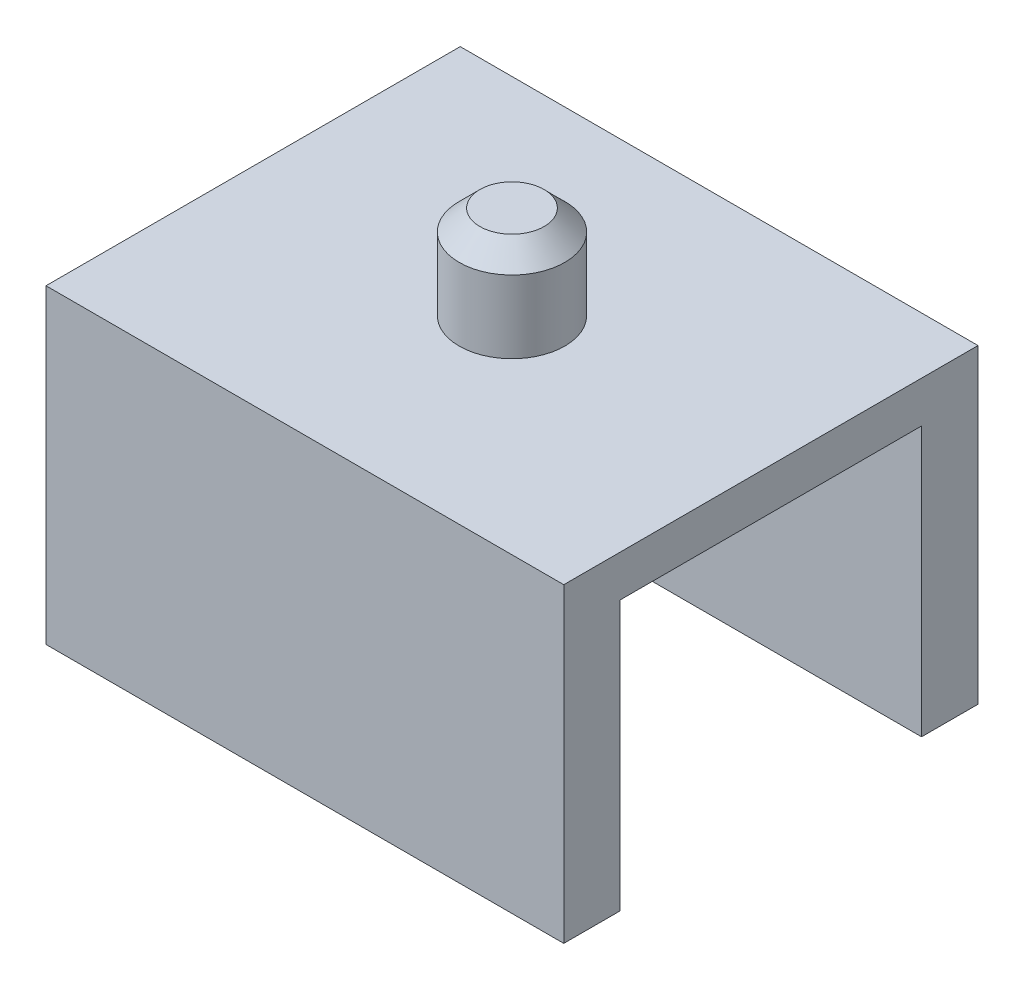
ISO-10303-21;
HEADER;
FILE_DESCRIPTION(('STEP AP214'),'2;1');
FILE_NAME('part.step','',(''),(''),'','','');
FILE_SCHEMA(('AUTOMOTIVE_DESIGN { 1 0 10303 214 1 1 1 1 }'));
ENDSEC;
DATA;
#1=APPLICATION_CONTEXT('core data for automotive mechanical design processes');
#2=APPLICATION_PROTOCOL_DEFINITION('international standard','automotive_design',2000,#1);
#3=PRODUCT_CONTEXT('',#1,'mechanical');
#4=PRODUCT('Part','Part','',(#3));
#5=PRODUCT_RELATED_PRODUCT_CATEGORY('part','',(#4));
#6=PRODUCT_DEFINITION_FORMATION('','',#4);
#7=PRODUCT_DEFINITION_CONTEXT('part definition',#1,'design');
#8=PRODUCT_DEFINITION('design','',#6,#7);
#9=PRODUCT_DEFINITION_SHAPE('','',#8);
#10=(LENGTH_UNIT() NAMED_UNIT(*) SI_UNIT(.MILLI.,.METRE.));
#11=(NAMED_UNIT(*) PLANE_ANGLE_UNIT() SI_UNIT($,.RADIAN.));
#12=(NAMED_UNIT(*) SI_UNIT($,.STERADIAN.) SOLID_ANGLE_UNIT());
#13=UNCERTAINTY_MEASURE_WITH_UNIT(LENGTH_MEASURE(1.E-05),#10,'distance_accuracy_value','');
#14=(GEOMETRIC_REPRESENTATION_CONTEXT(3) GLOBAL_UNCERTAINTY_ASSIGNED_CONTEXT((#13)) GLOBAL_UNIT_ASSIGNED_CONTEXT((#10,
#11,#12)) REPRESENTATION_CONTEXT('',''));
#15=CARTESIAN_POINT('',(0.,0.,0.));
#16=DIRECTION('',(0.,0.,1.));
#17=DIRECTION('',(1.,0.,0.));
#18=AXIS2_PLACEMENT_3D('',#15,#16,#17);
#19=CARTESIAN_POINT('',(25.,0.,20.));
#20=DIRECTION('',(0.,1.,0.));
#21=DIRECTION('',(-1.,0.,0.));
#22=AXIS2_PLACEMENT_3D('',#19,#20,#21);
#23=PLANE('',#22);
#24=DIRECTION('',(0.,0.,-1.));
#25=VECTOR('',#24,1.);
#26=CARTESIAN_POINT('',(0.,0.,20.));
#27=LINE('',#26,#25);
#28=CARTESIAN_POINT('',(0.,0.,20.));
#29=VERTEX_POINT('',#28);
#30=CARTESIAN_POINT('',(0.,0.,17.275));
#31=VERTEX_POINT('',#30);
#32=EDGE_CURVE('E170',#29,#31,#27,.T.);
#33=ORIENTED_EDGE('',*,*,#32,.T.);
#34=DIRECTION('',(-1.,0.,0.));
#35=VECTOR('',#34,1.);
#36=CARTESIAN_POINT('',(25.,0.,17.275));
#37=LINE('',#36,#35);
#38=CARTESIAN_POINT('',(25.,0.,17.275));
#39=VERTEX_POINT('',#38);
#40=EDGE_CURVE('E135',#39,#31,#37,.T.);
#41=ORIENTED_EDGE('',*,*,#40,.F.);
#42=DIRECTION('',(0.,0.,-1.));
#43=VECTOR('',#42,1.);
#44=CARTESIAN_POINT('',(25.,0.,20.));
#45=LINE('',#44,#43);
#46=CARTESIAN_POINT('',(25.,0.,20.));
#47=VERTEX_POINT('',#46);
#48=EDGE_CURVE('E183',#47,#39,#45,.T.);
#49=ORIENTED_EDGE('',*,*,#48,.F.);
#50=DIRECTION('',(1.,0.,0.));
#51=VECTOR('',#50,1.);
#52=CARTESIAN_POINT('',(25.,0.,20.));
#53=LINE('',#52,#51);
#54=EDGE_CURVE('E147',#29,#47,#53,.T.);
#55=ORIENTED_EDGE('',*,*,#54,.F.);
#56=EDGE_LOOP('',(#33,#41,#49,#55));
#57=FACE_BOUND('',#56,.T.);
#58=ADVANCED_FACE('F41',(#57),#23,.F.);
#59=CARTESIAN_POINT('',(25.,0.,2.725));
#60=VERTEX_POINT('',#59);
#61=CARTESIAN_POINT('',(25.,0.,0.));
#62=VERTEX_POINT('',#61);
#63=EDGE_CURVE('E182',#60,#62,#45,.T.);
#64=ORIENTED_EDGE('',*,*,#63,.F.);
#65=DIRECTION('',(1.,0.,0.));
#66=VECTOR('',#65,1.);
#67=CARTESIAN_POINT('',(0.,0.,2.725));
#68=LINE('',#67,#66);
#69=CARTESIAN_POINT('',(0.,0.,2.725));
#70=VERTEX_POINT('',#69);
#71=EDGE_CURVE('E251',#70,#60,#68,.T.);
#72=ORIENTED_EDGE('',*,*,#71,.F.);
#73=CARTESIAN_POINT('',(0.,0.,0.));
#74=VERTEX_POINT('',#73);
#75=EDGE_CURVE('E89',#70,#74,#27,.T.);
#76=ORIENTED_EDGE('',*,*,#75,.T.);
#77=DIRECTION('',(1.,0.,0.));
#78=VECTOR('',#77,1.);
#79=CARTESIAN_POINT('',(25.,0.,0.));
#80=LINE('',#79,#78);
#81=EDGE_CURVE('E158',#74,#62,#80,.T.);
#82=ORIENTED_EDGE('',*,*,#81,.T.);
#83=EDGE_LOOP('',(#64,#72,#76,#82));
#84=FACE_BOUND('',#83,.T.);
#85=ADVANCED_FACE('F209',(#84),#23,.F.);
#86=CARTESIAN_POINT('',(25.,15.,20.));
#87=DIRECTION('',(-1.,0.,0.));
#88=DIRECTION('',(0.,-1.,0.));
#89=AXIS2_PLACEMENT_3D('',#86,#87,#88);
#90=PLANE('',#89);
#91=ORIENTED_EDGE('',*,*,#48,.T.);
#92=DIRECTION('',(0.,-1.,0.));
#93=VECTOR('',#92,1.);
#94=CARTESIAN_POINT('',(25.,13.,17.275));
#95=LINE('',#94,#93);
#96=CARTESIAN_POINT('',(25.,13.,17.275));
#97=VERTEX_POINT('',#96);
#98=EDGE_CURVE('E142',#97,#39,#95,.T.);
#99=ORIENTED_EDGE('',*,*,#98,.F.);
#100=DIRECTION('',(0.,0.,1.));
#101=VECTOR('',#100,1.);
#102=CARTESIAN_POINT('',(25.,13.,2.725));
#103=LINE('',#102,#101);
#104=CARTESIAN_POINT('',(25.,13.,2.725));
#105=VERTEX_POINT('',#104);
#106=EDGE_CURVE('E127',#105,#97,#103,.T.);
#107=ORIENTED_EDGE('',*,*,#106,.F.);
#108=DIRECTION('',(0.,-1.,0.));
#109=VECTOR('',#108,1.);
#110=CARTESIAN_POINT('',(25.,13.,2.725));
#111=LINE('',#110,#109);
#112=EDGE_CURVE('E124',#105,#60,#111,.T.);
#113=ORIENTED_EDGE('',*,*,#112,.T.);
#114=ORIENTED_EDGE('',*,*,#63,.T.);
#115=DIRECTION('',(0.,1.,0.));
#116=VECTOR('',#115,1.);
#117=CARTESIAN_POINT('',(25.,15.,0.));
#118=LINE('',#117,#116);
#119=CARTESIAN_POINT('',(25.,15.,0.));
#120=VERTEX_POINT('',#119);
#121=EDGE_CURVE('E161',#62,#120,#118,.T.);
#122=ORIENTED_EDGE('',*,*,#121,.T.);
#123=DIRECTION('',(0.,0.,-1.));
#124=VECTOR('',#123,1.);
#125=CARTESIAN_POINT('',(25.,15.,20.));
#126=LINE('',#125,#124);
#127=CARTESIAN_POINT('',(25.,15.,20.));
#128=VERTEX_POINT('',#127);
#129=EDGE_CURVE('E178',#128,#120,#126,.T.);
#130=ORIENTED_EDGE('',*,*,#129,.F.);
#131=DIRECTION('',(0.,1.,0.));
#132=VECTOR('',#131,1.);
#133=CARTESIAN_POINT('',(25.,15.,20.));
#134=LINE('',#133,#132);
#135=EDGE_CURVE('E97',#47,#128,#134,.T.);
#136=ORIENTED_EDGE('',*,*,#135,.F.);
#137=EDGE_LOOP('',(#91,#99,#107,#113,#114,#122,#130,#136));
#138=FACE_BOUND('',#137,.T.);
#139=ADVANCED_FACE('F215',(#138),#90,.F.);
#140=CARTESIAN_POINT('',(0.,15.,20.));
#141=DIRECTION('',(0.,-1.,0.));
#142=DIRECTION('',(0.,0.,-1.));
#143=AXIS2_PLACEMENT_3D('',#140,#141,#142);
#144=PLANE('',#143);
#145=CARTESIAN_POINT('',(12.5,15.,10.));
#146=DIRECTION('',(0.,1.,0.));
#147=DIRECTION('',(0.,0.,1.));
#148=AXIS2_PLACEMENT_3D('',#145,#146,#147);
#149=CIRCLE('',#148,2.55);
#150=CARTESIAN_POINT('',(12.5,15.,12.55));
#151=VERTEX_POINT('',#150);
#152=EDGE_CURVE('E186',#151,#151,#149,.T.);
#153=ORIENTED_EDGE('',*,*,#152,.F.);
#154=EDGE_LOOP('',(#153));
#155=FACE_BOUND('',#154,.T.);
#156=DIRECTION('',(-1.,0.,0.));
#157=VECTOR('',#156,1.);
#158=CARTESIAN_POINT('',(0.,15.,0.));
#159=LINE('',#158,#157);
#160=CARTESIAN_POINT('',(0.,15.,0.));
#161=VERTEX_POINT('',#160);
#162=EDGE_CURVE('E165',#120,#161,#159,.T.);
#163=ORIENTED_EDGE('',*,*,#162,.T.);
#164=DIRECTION('',(0.,0.,-1.));
#165=VECTOR('',#164,1.);
#166=CARTESIAN_POINT('',(0.,15.,20.));
#167=LINE('',#166,#165);
#168=CARTESIAN_POINT('',(0.,15.,20.));
#169=VERTEX_POINT('',#168);
#170=EDGE_CURVE('E174',#169,#161,#167,.T.);
#171=ORIENTED_EDGE('',*,*,#170,.F.);
#172=DIRECTION('',(-1.,0.,0.));
#173=VECTOR('',#172,1.);
#174=CARTESIAN_POINT('',(0.,15.,20.));
#175=LINE('',#174,#173);
#176=EDGE_CURVE('E153',#128,#169,#175,.T.);
#177=ORIENTED_EDGE('',*,*,#176,.F.);
#178=ORIENTED_EDGE('',*,*,#129,.T.);
#179=EDGE_LOOP('',(#163,#171,#177,#178));
#180=FACE_BOUND('',#179,.T.);
#181=ADVANCED_FACE('F265',(#155,#180),#144,.F.);
#182=CARTESIAN_POINT('',(0.,0.,20.));
#183=DIRECTION('',(1.,0.,0.));
#184=DIRECTION('',(0.,0.,-1.));
#185=AXIS2_PLACEMENT_3D('',#182,#183,#184);
#186=PLANE('',#185);
#187=DIRECTION('',(0.,0.,-1.));
#188=VECTOR('',#187,1.);
#189=CARTESIAN_POINT('',(0.,13.,17.275));
#190=LINE('',#189,#188);
#191=CARTESIAN_POINT('',(0.,13.,17.275));
#192=VERTEX_POINT('',#191);
#193=CARTESIAN_POINT('',(0.,13.,2.725));
#194=VERTEX_POINT('',#193);
#195=EDGE_CURVE('E128',#192,#194,#190,.T.);
#196=ORIENTED_EDGE('',*,*,#195,.F.);
#197=DIRECTION('',(0.,-1.,0.));
#198=VECTOR('',#197,1.);
#199=CARTESIAN_POINT('',(0.,13.,17.275));
#200=LINE('',#199,#198);
#201=EDGE_CURVE('E162',#192,#31,#200,.T.);
#202=ORIENTED_EDGE('',*,*,#201,.T.);
#203=ORIENTED_EDGE('',*,*,#32,.F.);
#204=DIRECTION('',(0.,-1.,0.));
#205=VECTOR('',#204,1.);
#206=CARTESIAN_POINT('',(0.,0.,20.));
#207=LINE('',#206,#205);
#208=EDGE_CURVE('E67',#169,#29,#207,.T.);
#209=ORIENTED_EDGE('',*,*,#208,.F.);
#210=ORIENTED_EDGE('',*,*,#170,.T.);
#211=DIRECTION('',(0.,-1.,0.));
#212=VECTOR('',#211,1.);
#213=CARTESIAN_POINT('',(0.,0.,0.));
#214=LINE('',#213,#212);
#215=EDGE_CURVE('E150',#161,#74,#214,.T.);
#216=ORIENTED_EDGE('',*,*,#215,.T.);
#217=ORIENTED_EDGE('',*,*,#75,.F.);
#218=DIRECTION('',(0.,-1.,0.));
#219=VECTOR('',#218,1.);
#220=CARTESIAN_POINT('',(0.,13.,2.725));
#221=LINE('',#220,#219);
#222=EDGE_CURVE('E122',#194,#70,#221,.T.);
#223=ORIENTED_EDGE('',*,*,#222,.F.);
#224=EDGE_LOOP('',(#196,#202,#203,#209,#210,#216,#217,#223));
#225=FACE_BOUND('',#224,.T.);
#226=ADVANCED_FACE('F137',(#225),#186,.F.);
#227=CARTESIAN_POINT('',(0.,0.,20.));
#228=DIRECTION('',(0.,0.,-1.));
#229=DIRECTION('',(-1.,0.,0.));
#230=AXIS2_PLACEMENT_3D('',#227,#228,#229);
#231=PLANE('',#230);
#232=ORIENTED_EDGE('',*,*,#54,.T.);
#233=ORIENTED_EDGE('',*,*,#135,.T.);
#234=ORIENTED_EDGE('',*,*,#176,.T.);
#235=ORIENTED_EDGE('',*,*,#208,.T.);
#236=EDGE_LOOP('',(#232,#233,#234,#235));
#237=FACE_BOUND('',#236,.T.);
#238=ADVANCED_FACE('F272',(#237),#231,.F.);
#239=CARTESIAN_POINT('',(0.,0.,0.));
#240=DIRECTION('',(0.,0.,-1.));
#241=DIRECTION('',(-1.,0.,0.));
#242=AXIS2_PLACEMENT_3D('',#239,#240,#241);
#243=PLANE('',#242);
#244=ORIENTED_EDGE('',*,*,#81,.F.);
#245=ORIENTED_EDGE('',*,*,#215,.F.);
#246=ORIENTED_EDGE('',*,*,#162,.F.);
#247=ORIENTED_EDGE('',*,*,#121,.F.);
#248=EDGE_LOOP('',(#244,#245,#246,#247));
#249=FACE_BOUND('',#248,.T.);
#250=ADVANCED_FACE('F276',(#249),#243,.T.);
#251=CARTESIAN_POINT('',(25.,13.,17.275));
#252=DIRECTION('',(0.,0.,1.));
#253=DIRECTION('',(1.,0.,0.));
#254=AXIS2_PLACEMENT_3D('',#251,#252,#253);
#255=PLANE('',#254);
#256=ORIENTED_EDGE('',*,*,#40,.T.);
#257=ORIENTED_EDGE('',*,*,#201,.F.);
#258=DIRECTION('',(-1.,0.,0.));
#259=VECTOR('',#258,1.);
#260=CARTESIAN_POINT('',(25.,13.,17.275));
#261=LINE('',#260,#259);
#262=EDGE_CURVE('E58',#97,#192,#261,.T.);
#263=ORIENTED_EDGE('',*,*,#262,.F.);
#264=ORIENTED_EDGE('',*,*,#98,.T.);
#265=EDGE_LOOP('',(#256,#257,#263,#264));
#266=FACE_BOUND('',#265,.T.);
#267=ADVANCED_FACE('F261',(#266),#255,.F.);
#268=CARTESIAN_POINT('',(0.,13.,2.725));
#269=DIRECTION('',(0.,0.,-1.));
#270=DIRECTION('',(-1.,0.,0.));
#271=AXIS2_PLACEMENT_3D('',#268,#269,#270);
#272=PLANE('',#271);
#273=ORIENTED_EDGE('',*,*,#71,.T.);
#274=ORIENTED_EDGE('',*,*,#112,.F.);
#275=DIRECTION('',(1.,0.,0.));
#276=VECTOR('',#275,1.);
#277=CARTESIAN_POINT('',(0.,13.,2.725));
#278=LINE('',#277,#276);
#279=EDGE_CURVE('E119',#194,#105,#278,.T.);
#280=ORIENTED_EDGE('',*,*,#279,.F.);
#281=ORIENTED_EDGE('',*,*,#222,.T.);
#282=EDGE_LOOP('',(#273,#274,#280,#281));
#283=FACE_BOUND('',#282,.T.);
#284=ADVANCED_FACE('F120',(#283),#272,.F.);
#285=CARTESIAN_POINT('',(0.,13.,0.));
#286=DIRECTION('',(0.,-1.,0.));
#287=DIRECTION('',(1.,0.,0.));
#288=AXIS2_PLACEMENT_3D('',#285,#286,#287);
#289=PLANE('',#288);
#290=CARTESIAN_POINT('',(12.5,13.,10.));
#291=DIRECTION('',(0.,-1.,0.));
#292=DIRECTION('',(1.,0.,0.));
#293=AXIS2_PLACEMENT_3D('',#290,#291,#292);
#294=CIRCLE('',#293,1.25);
#295=CARTESIAN_POINT('',(13.75,13.,10.));
#296=VERTEX_POINT('',#295);
#297=EDGE_CURVE('E247',#296,#296,#294,.T.);
#298=ORIENTED_EDGE('',*,*,#297,.F.);
#299=EDGE_LOOP('',(#298));
#300=FACE_BOUND('',#299,.T.);
#301=ORIENTED_EDGE('',*,*,#195,.T.);
#302=ORIENTED_EDGE('',*,*,#279,.T.);
#303=ORIENTED_EDGE('',*,*,#106,.T.);
#304=ORIENTED_EDGE('',*,*,#262,.T.);
#305=EDGE_LOOP('',(#301,#302,#303,#304));
#306=FACE_BOUND('',#305,.T.);
#307=ADVANCED_FACE('F131',(#300,#306),#289,.T.);
#308=CARTESIAN_POINT('',(12.5,19.5,10.));
#309=DIRECTION('',(0.,-1.,0.));
#310=DIRECTION('',(0.,0.,-1.));
#311=AXIS2_PLACEMENT_3D('',#308,#309,#310);
#312=CYLINDRICAL_SURFACE('',#311,2.55);
#313=CARTESIAN_POINT('',(12.5,18.5,10.));
#314=DIRECTION('',(0.,1.,0.));
#315=DIRECTION('',(0.,0.,1.));
#316=AXIS2_PLACEMENT_3D('',#313,#314,#315);
#317=CIRCLE('',#316,2.55);
#318=CARTESIAN_POINT('',(12.5,18.5,12.55));
#319=VERTEX_POINT('',#318);
#320=EDGE_CURVE('E191',#319,#319,#317,.F.);
#321=ORIENTED_EDGE('',*,*,#320,.T.);
#322=EDGE_LOOP('',(#321));
#323=FACE_BOUND('',#322,.T.);
#324=ORIENTED_EDGE('',*,*,#152,.T.);
#325=EDGE_LOOP('',(#324));
#326=FACE_BOUND('',#325,.T.);
#327=ADVANCED_FACE('F231',(#323,#326),#312,.T.);
#328=CARTESIAN_POINT('',(12.5,19.5,10.));
#329=DIRECTION('',(0.,1.,0.));
#330=DIRECTION('',(0.,0.,1.));
#331=AXIS2_PLACEMENT_3D('',#328,#329,#330);
#332=PLANE('',#331);
#333=CARTESIAN_POINT('',(12.5,19.5,10.));
#334=DIRECTION('',(0.,1.,0.));
#335=DIRECTION('',(0.,0.,1.));
#336=AXIS2_PLACEMENT_3D('',#333,#334,#335);
#337=CIRCLE('',#336,1.55);
#338=CARTESIAN_POINT('',(12.5,19.5,11.55));
#339=VERTEX_POINT('',#338);
#340=EDGE_CURVE('E187',#339,#339,#337,.T.);
#341=ORIENTED_EDGE('',*,*,#340,.T.);
#342=EDGE_LOOP('',(#341));
#343=FACE_BOUND('',#342,.T.);
#344=ADVANCED_FACE('F223',(#343),#332,.T.);
#345=CARTESIAN_POINT('',(12.5,19.5,10.));
#346=DIRECTION('',(0.,-1.,0.));
#347=DIRECTION('',(0.,0.,-1.));
#348=AXIS2_PLACEMENT_3D('',#345,#346,#347);
#349=CONICAL_SURFACE('',#348,1.55,0.785398163397447);
#350=ORIENTED_EDGE('',*,*,#320,.F.);
#351=EDGE_LOOP('',(#350));
#352=FACE_BOUND('',#351,.T.);
#353=ORIENTED_EDGE('',*,*,#340,.F.);
#354=EDGE_LOOP('',(#353));
#355=FACE_BOUND('',#354,.T.);
#356=ADVANCED_FACE('F219',(#352,#355),#349,.T.);
#357=CARTESIAN_POINT('',(12.5,10.5,10.));
#358=DIRECTION('',(0.,1.,0.));
#359=DIRECTION('',(-1.,0.,0.));
#360=AXIS2_PLACEMENT_3D('',#357,#358,#359);
#361=CYLINDRICAL_SURFACE('',#360,1.25);
#362=CARTESIAN_POINT('',(12.5,11.5,10.));
#363=DIRECTION('',(0.,-1.,0.));
#364=DIRECTION('',(0.,0.,-1.));
#365=AXIS2_PLACEMENT_3D('',#362,#363,#364);
#366=CIRCLE('',#365,1.25);
#367=CARTESIAN_POINT('',(12.5,11.5,11.25));
#368=VERTEX_POINT('',#367);
#369=EDGE_CURVE('E11',#368,#368,#366,.F.);
#370=ORIENTED_EDGE('',*,*,#369,.T.);
#371=EDGE_LOOP('',(#370));
#372=FACE_BOUND('',#371,.T.);
#373=ORIENTED_EDGE('',*,*,#297,.T.);
#374=EDGE_LOOP('',(#373));
#375=FACE_BOUND('',#374,.T.);
#376=ADVANCED_FACE('F205',(#372,#375),#361,.T.);
#377=CARTESIAN_POINT('',(12.5,10.5,10.));
#378=DIRECTION('',(0.,-1.,0.));
#379=DIRECTION('',(1.,0.,0.));
#380=AXIS2_PLACEMENT_3D('',#377,#378,#379);
#381=PLANE('',#380);
#382=CARTESIAN_POINT('',(12.5,10.5,10.));
#383=DIRECTION('',(0.,-1.,0.));
#384=DIRECTION('',(1.,0.,0.));
#385=AXIS2_PLACEMENT_3D('',#382,#383,#384);
#386=CIRCLE('',#385,0.249999999999993);
#387=CARTESIAN_POINT('',(12.5,10.5,10.25));
#388=VERTEX_POINT('',#387);
#389=EDGE_CURVE('E51',#388,#388,#386,.T.);
#390=ORIENTED_EDGE('',*,*,#389,.T.);
#391=EDGE_LOOP('',(#390));
#392=FACE_BOUND('',#391,.T.);
#393=ADVANCED_FACE('F198',(#392),#381,.T.);
#394=CARTESIAN_POINT('',(12.5,10.5,10.));
#395=DIRECTION('',(0.,1.,0.));
#396=DIRECTION('',(0.,0.,1.));
#397=AXIS2_PLACEMENT_3D('',#394,#395,#396);
#398=CONICAL_SURFACE('',#397,0.249999999999993,0.785398163397448);
#399=CARTESIAN_POINT('',(12.5,11.5,11.25));
#400=CARTESIAN_POINT('',(12.5,11.4895833333333,11.2395833333333));
#401=CARTESIAN_POINT('',(12.5,11.4791666666667,11.2291666666667));
#402=CARTESIAN_POINT('',(12.5,11.4583333333333,11.2083333333333));
#403=CARTESIAN_POINT('',(12.5,11.4479166666667,11.1979166666667));
#404=CARTESIAN_POINT('',(12.5,11.4270833333333,11.1770833333333));
#405=CARTESIAN_POINT('',(12.5,11.4166666666667,11.1666666666667));
#406=CARTESIAN_POINT('',(12.5,11.3958333333333,11.1458333333333));
#407=CARTESIAN_POINT('',(12.5,11.3854166666667,11.1354166666667));
#408=CARTESIAN_POINT('',(12.5,11.3645833333333,11.1145833333333));
#409=CARTESIAN_POINT('',(12.5,11.3541666666667,11.1041666666667));
#410=CARTESIAN_POINT('',(12.5,11.3333333333333,11.0833333333333));
#411=CARTESIAN_POINT('',(12.5,11.3229166666667,11.0729166666667));
#412=CARTESIAN_POINT('',(12.5,11.3020833333333,11.0520833333333));
#413=CARTESIAN_POINT('',(12.5,11.2916666666667,11.0416666666667));
#414=CARTESIAN_POINT('',(12.5,11.2708333333333,11.0208333333333));
#415=CARTESIAN_POINT('',(12.5,11.2604166666667,11.0104166666667));
#416=CARTESIAN_POINT('',(12.5,11.2395833333333,10.9895833333333));
#417=CARTESIAN_POINT('',(12.5,11.2291666666667,10.9791666666667));
#418=CARTESIAN_POINT('',(12.5,11.2083333333333,10.9583333333333));
#419=CARTESIAN_POINT('',(12.5,11.1979166666667,10.9479166666667));
#420=CARTESIAN_POINT('',(12.5,11.1770833333333,10.9270833333333));
#421=CARTESIAN_POINT('',(12.5,11.1666666666667,10.9166666666667));
#422=CARTESIAN_POINT('',(12.5,11.1458333333333,10.8958333333333));
#423=CARTESIAN_POINT('',(12.5,11.1354166666667,10.8854166666667));
#424=CARTESIAN_POINT('',(12.5,11.1145833333333,10.8645833333333));
#425=CARTESIAN_POINT('',(12.5,11.1041666666667,10.8541666666667));
#426=CARTESIAN_POINT('',(12.5,11.0833333333333,10.8333333333333));
#427=CARTESIAN_POINT('',(12.5,11.0729166666667,10.8229166666667));
#428=CARTESIAN_POINT('',(12.5,11.0520833333333,10.8020833333333));
#429=CARTESIAN_POINT('',(12.5,11.0416666666667,10.7916666666667));
#430=CARTESIAN_POINT('',(12.5,11.0208333333333,10.7708333333333));
#431=CARTESIAN_POINT('',(12.5,11.0104166666667,10.7604166666667));
#432=CARTESIAN_POINT('',(12.5,10.9895833333333,10.7395833333333));
#433=CARTESIAN_POINT('',(12.5,10.9791666666667,10.7291666666667));
#434=CARTESIAN_POINT('',(12.5,10.9583333333333,10.7083333333333));
#435=CARTESIAN_POINT('',(12.5,10.9479166666667,10.6979166666667));
#436=CARTESIAN_POINT('',(12.5,10.9270833333333,10.6770833333333));
#437=CARTESIAN_POINT('',(12.5,10.9166666666667,10.6666666666667));
#438=CARTESIAN_POINT('',(12.5,10.8958333333333,10.6458333333333));
#439=CARTESIAN_POINT('',(12.5,10.8854166666667,10.6354166666667));
#440=CARTESIAN_POINT('',(12.5,10.8645833333333,10.6145833333333));
#441=CARTESIAN_POINT('',(12.5,10.8541666666667,10.6041666666667));
#442=CARTESIAN_POINT('',(12.5,10.8333333333333,10.5833333333333));
#443=CARTESIAN_POINT('',(12.5,10.8229166666667,10.5729166666667));
#444=CARTESIAN_POINT('',(12.5,10.8020833333333,10.5520833333333));
#445=CARTESIAN_POINT('',(12.5,10.7916666666667,10.5416666666667));
#446=CARTESIAN_POINT('',(12.5,10.7708333333333,10.5208333333333));
#447=CARTESIAN_POINT('',(12.5,10.7604166666667,10.5104166666667));
#448=CARTESIAN_POINT('',(12.5,10.7395833333333,10.4895833333333));
#449=CARTESIAN_POINT('',(12.5,10.7291666666667,10.4791666666667));
#450=CARTESIAN_POINT('',(12.5,10.7083333333333,10.4583333333333));
#451=CARTESIAN_POINT('',(12.5,10.6979166666667,10.4479166666667));
#452=CARTESIAN_POINT('',(12.5,10.6770833333333,10.4270833333333));
#453=CARTESIAN_POINT('',(12.5,10.6666666666667,10.4166666666667));
#454=CARTESIAN_POINT('',(12.5,10.6458333333333,10.3958333333333));
#455=CARTESIAN_POINT('',(12.5,10.6354166666667,10.3854166666667));
#456=CARTESIAN_POINT('',(12.5,10.6145833333333,10.3645833333333));
#457=CARTESIAN_POINT('',(12.5,10.6041666666667,10.3541666666667));
#458=CARTESIAN_POINT('',(12.5,10.5833333333333,10.3333333333333));
#459=CARTESIAN_POINT('',(12.5,10.5729166666667,10.3229166666667));
#460=CARTESIAN_POINT('',(12.5,10.5520833333333,10.3020833333333));
#461=CARTESIAN_POINT('',(12.5,10.5416666666667,10.2916666666667));
#462=CARTESIAN_POINT('',(12.5,10.5208333333333,10.2708333333333));
#463=CARTESIAN_POINT('',(12.5,10.5104166666667,10.2604166666667));
#464=CARTESIAN_POINT('',(12.5,10.5,10.25));
#465=B_SPLINE_CURVE_WITH_KNOTS('',3,(#399,#400,#401,#402,#403,#404,#405,#406,#407,#408,#409,
#410,#411,#412,#413,#414,#415,#416,#417,#418,#419,#420,#421,#422,#423,#424,#425,#426,#427,#428,
#429,#430,#431,#432,#433,#434,#435,#436,#437,#438,#439,#440,#441,#442,#443,#444,#445,#446,#447,
#448,#449,#450,#451,#452,#453,#454,#455,#456,#457,#458,#459,#460,#461,#462,#463,#464),
.UNSPECIFIED.,.F.,.F.,(4,2,2,2,2,2,2,2,2,2,2,2,2,2,2,2,2,2,2,2,2,2,2,2,2,2,2,2,2,2,2,2,4),(0.,
0.0441941738241593,0.0883883476483185,0.132582521472478,0.176776695296637,0.220970869120796,
0.265165042944956,0.309359216769115,0.353553390593274,0.397747564417433,0.441941738241593,
0.486135912065753,0.530330085889914,0.574524259714073,0.618718433538232,0.662912607362391,
0.707106781186551,0.75130095501071,0.795495128834869,0.839689302659029,0.883883476483188,
0.92807765030735,0.972271824131509,1.01646599795567,1.06066017177983,1.10485434560399,
1.14904851942815,1.19324269325231,1.23743686707646,1.28163104090062,1.32582521472478,
1.37001938854894,1.4142135623731),.UNSPECIFIED.);
#466=EDGE_CURVE('BSEAM44',#368,#388,#465,.T.);
#467=ORIENTED_EDGE('',*,*,#369,.F.);
#468=ORIENTED_EDGE('',*,*,#389,.F.);
#469=ORIENTED_EDGE('',*,*,#466,.T.);
#470=ORIENTED_EDGE('',*,*,#466,.F.);
#471=EDGE_LOOP('',(#467,#469,#468,#470));
#472=FACE_BOUND('',#471,.T.);
#473=ADVANCED_FACE('F44',(#472),#398,.T.);
#474=CLOSED_SHELL('',(#58,#85,#139,#181,#226,#238,#250,#267,#284,#307,#327,#344,#356,#376,#393,#473));
#475=MANIFOLD_SOLID_BREP('B2',#474);
#476=ADVANCED_BREP_SHAPE_REPRESENTATION('',(#18,#475),#14);
#477=SHAPE_DEFINITION_REPRESENTATION(#9,#476);
ENDSEC;
END-ISO-10303-21;
